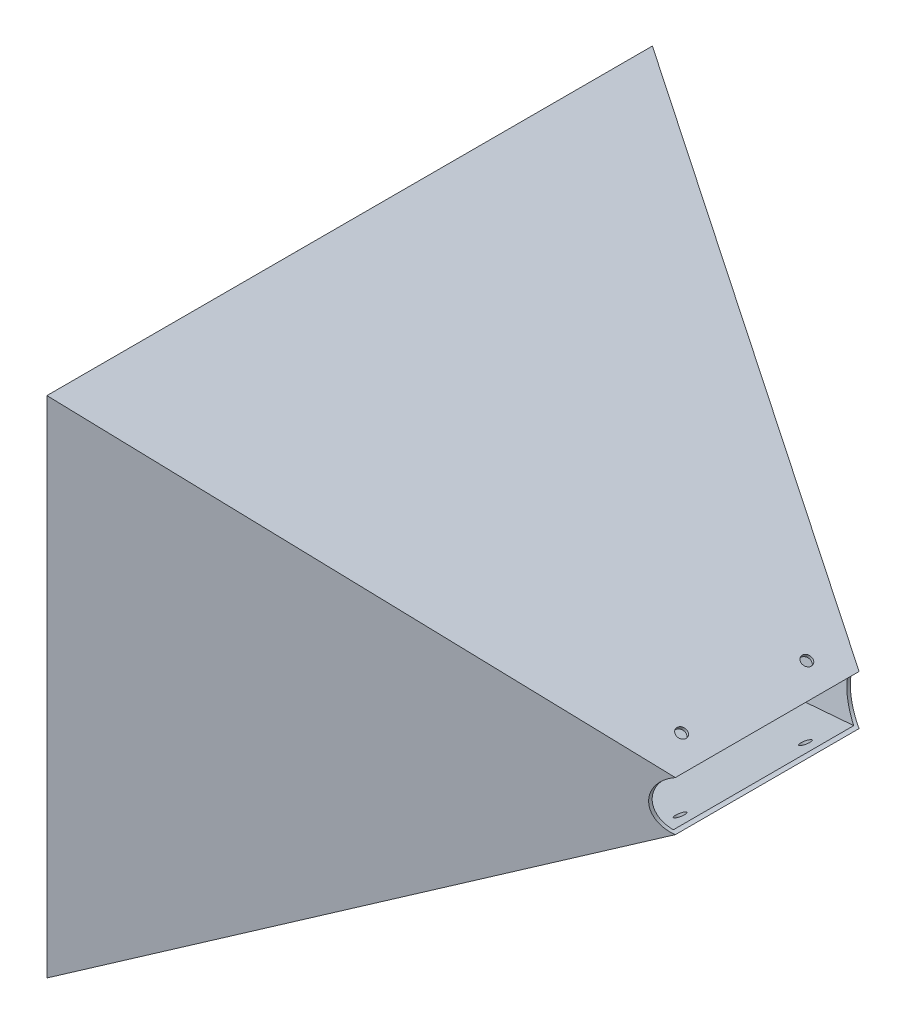
ISO-10303-21;
HEADER;
FILE_DESCRIPTION(('STEP AP214'),'2;1');
FILE_NAME('part.step','',(''),(''),'','','');
FILE_SCHEMA(('AUTOMOTIVE_DESIGN { 1 0 10303 214 1 1 1 1 }'));
ENDSEC;
DATA;
#1=APPLICATION_CONTEXT('core data for automotive mechanical design processes');
#2=APPLICATION_PROTOCOL_DEFINITION('international standard','automotive_design',2000,#1);
#3=PRODUCT_CONTEXT('',#1,'mechanical');
#4=PRODUCT('Part','Part','',(#3));
#5=PRODUCT_RELATED_PRODUCT_CATEGORY('part','',(#4));
#6=PRODUCT_DEFINITION_FORMATION('','',#4);
#7=PRODUCT_DEFINITION_CONTEXT('part definition',#1,'design');
#8=PRODUCT_DEFINITION('design','',#6,#7);
#9=PRODUCT_DEFINITION_SHAPE('','',#8);
#10=(LENGTH_UNIT() NAMED_UNIT(*) SI_UNIT(.MILLI.,.METRE.));
#11=(NAMED_UNIT(*) PLANE_ANGLE_UNIT() SI_UNIT($,.RADIAN.));
#12=(NAMED_UNIT(*) SI_UNIT($,.STERADIAN.) SOLID_ANGLE_UNIT());
#13=UNCERTAINTY_MEASURE_WITH_UNIT(LENGTH_MEASURE(1.E-05),#10,'distance_accuracy_value','');
#14=(GEOMETRIC_REPRESENTATION_CONTEXT(3) GLOBAL_UNCERTAINTY_ASSIGNED_CONTEXT((#13)) GLOBAL_UNIT_ASSIGNED_CONTEXT((#10,
#11,#12)) REPRESENTATION_CONTEXT('',''));
#15=CARTESIAN_POINT('',(0.,0.,0.));
#16=DIRECTION('',(0.,0.,1.));
#17=DIRECTION('',(1.,0.,0.));
#18=AXIS2_PLACEMENT_3D('',#15,#16,#17);
#19=CARTESIAN_POINT('',(-3.99999999999992,-290.,189.));
#20=DIRECTION('',(0.450780571280258,0.,0.892634794614373));
#21=DIRECTION('',(0.892634794614373,0.,-0.450780571280258));
#22=AXIS2_PLACEMENT_3D('',#19,#20,#21);
#23=PLANE('',#22);
#24=DIRECTION('',(0.802754938265514,0.437312758241847,-0.405391243824085));
#25=VECTOR('',#24,1.);
#26=CARTESIAN_POINT('',(-36.8684121138477,-29.7482783457112,205.598548117493));
#27=LINE('',#26,#25);
#28=CARTESIAN_POINT('',(-204.,-120.795710387367,290.));
#29=VERTEX_POINT('',#28);
#30=CARTESIAN_POINT('',(-4.,-11.842719282327,189.));
#31=VERTEX_POINT('',#30);
#32=EDGE_CURVE('E114',#29,#31,#27,.T.);
#33=ORIENTED_EDGE('',*,*,#32,.T.);
#34=CARTESIAN_POINT('',(0.,0.,186.98));
#35=DIRECTION('',(0.450780571280258,0.,0.892634794614373));
#36=DIRECTION('',(0.892634794614373,0.,-0.450780571280258));
#37=AXIS2_PLACEMENT_3D('',#34,#35,#36);
#38=ELLIPSE('',#37,14.0034872888863,12.5);
#39=CARTESIAN_POINT('',(-4.00000000000001,11.842719282327,189.));
#40=VERTEX_POINT('',#39);
#41=EDGE_CURVE('E100',#31,#40,#38,.F.);
#42=ORIENTED_EDGE('',*,*,#41,.T.);
#43=DIRECTION('',(-0.802754938265514,0.437312758241846,0.405391243824085));
#44=VECTOR('',#43,1.);
#45=CARTESIAN_POINT('',(-204.,120.795710387367,290.));
#46=LINE('',#45,#44);
#47=CARTESIAN_POINT('',(-204.,120.795710387367,290.));
#48=VERTEX_POINT('',#47);
#49=EDGE_CURVE('E111',#40,#48,#46,.T.);
#50=ORIENTED_EDGE('',*,*,#49,.T.);
#51=DIRECTION('',(0.,-1.,0.));
#52=VECTOR('',#51,1.);
#53=CARTESIAN_POINT('',(-204.,-120.795710387367,290.));
#54=LINE('',#53,#52);
#55=EDGE_CURVE('E123',#48,#29,#54,.T.);
#56=ORIENTED_EDGE('',*,*,#55,.T.);
#57=EDGE_LOOP('',(#33,#42,#50,#56));
#58=FACE_BOUND('',#57,.T.);
#59=ADVANCED_FACE('F34',(#58),#23,.T.);
#60=CARTESIAN_POINT('',(-3.99999999999992,-290.,101.));
#61=DIRECTION('',(0.450780571280258,0.,-0.892634794614373));
#62=DIRECTION('',(-0.892634794614373,0.,-0.450780571280258));
#63=AXIS2_PLACEMENT_3D('',#60,#61,#62);
#64=PLANE('',#63);
#65=DIRECTION('',(0.802754938265514,-0.437312758241846,0.405391243824085));
#66=VECTOR('',#65,1.);
#67=CARTESIAN_POINT('',(-109.625351356279,69.3837091162637,47.6591975650792));
#68=LINE('',#67,#66);
#69=CARTESIAN_POINT('',(-204.,120.795710387367,0.));
#70=VERTEX_POINT('',#69);
#71=CARTESIAN_POINT('',(-4.00000000000001,11.842719282327,101.));
#72=VERTEX_POINT('',#71);
#73=EDGE_CURVE('E125',#70,#72,#68,.T.);
#74=ORIENTED_EDGE('',*,*,#73,.T.);
#75=CARTESIAN_POINT('',(0.,0.,103.02));
#76=DIRECTION('',(0.450780571280258,0.,-0.892634794614373));
#77=DIRECTION('',(-0.892634794614373,0.,-0.450780571280258));
#78=AXIS2_PLACEMENT_3D('',#75,#76,#77);
#79=ELLIPSE('',#78,14.0034872888863,12.5);
#80=CARTESIAN_POINT('',(-4.,-11.842719282327,101.));
#81=VERTEX_POINT('',#80);
#82=EDGE_CURVE('E103',#72,#81,#79,.F.);
#83=ORIENTED_EDGE('',*,*,#82,.T.);
#84=DIRECTION('',(-0.802754938265514,-0.437312758241847,-0.405391243824085));
#85=VECTOR('',#84,1.);
#86=CARTESIAN_POINT('',(57.5062365298734,21.6637229253918,132.060649447586));
#87=LINE('',#86,#85);
#88=CARTESIAN_POINT('',(-204.,-120.795710387367,0.));
#89=VERTEX_POINT('',#88);
#90=EDGE_CURVE('E175',#81,#89,#87,.T.);
#91=ORIENTED_EDGE('',*,*,#90,.T.);
#92=DIRECTION('',(0.,-1.,0.));
#93=VECTOR('',#92,1.);
#94=CARTESIAN_POINT('',(-204.,-120.795710387367,0.));
#95=LINE('',#94,#93);
#96=EDGE_CURVE('E120',#70,#89,#95,.T.);
#97=ORIENTED_EDGE('',*,*,#96,.F.);
#98=EDGE_LOOP('',(#74,#83,#91,#97));
#99=FACE_BOUND('',#98,.T.);
#100=ADVANCED_FACE('F185',(#99),#64,.T.);
#101=CARTESIAN_POINT('',(-204.717578032364,119.478485361994,290.));
#102=DIRECTION('',(-0.478385354909303,-0.878150016915276,0.));
#103=DIRECTION('',(0.878150016915277,-0.478385354909303,0.));
#104=AXIS2_PLACEMENT_3D('',#101,#102,#103);
#105=PLANE('',#104);
#106=CARTESIAN_POINT('',(-15.7383607446507,16.5292304610658,115.));
#107=DIRECTION('',(-0.478385354909303,-0.878150016915276,0.));
#108=DIRECTION('',(0.878150016915277,-0.478385354909303,0.));
#109=AXIS2_PLACEMENT_3D('',#106,#107,#108);
#110=CIRCLE('',#109,2.5);
#111=CARTESIAN_POINT('',(-13.5429857023625,15.3332670737926,115.));
#112=VERTEX_POINT('',#111);
#113=EDGE_CURVE('E148',#112,#112,#110,.T.);
#114=ORIENTED_EDGE('',*,*,#113,.F.);
#115=EDGE_LOOP('',(#114));
#116=FACE_BOUND('',#115,.T.);
#117=CARTESIAN_POINT('',(-15.7383607446507,16.5292304610658,175.));
#118=DIRECTION('',(-0.478385354909303,-0.878150016915276,0.));
#119=DIRECTION('',(0.878150016915277,-0.478385354909303,0.));
#120=AXIS2_PLACEMENT_3D('',#117,#118,#119);
#121=CIRCLE('',#120,2.5);
#122=CARTESIAN_POINT('',(-13.5429857023625,15.3332670737926,175.));
#123=VERTEX_POINT('',#122);
#124=EDGE_CURVE('E145',#123,#123,#121,.T.);
#125=ORIENTED_EDGE('',*,*,#124,.F.);
#126=EDGE_LOOP('',(#125));
#127=FACE_BOUND('',#126,.T.);
#128=DIRECTION('',(0.802754938265514,-0.437312758241846,0.405391243824085));
#129=VECTOR('',#128,1.);
#130=CARTESIAN_POINT('',(-110.771859422809,68.3001501418769,48.7606294661478));
#131=LINE('',#130,#129);
#132=CARTESIAN_POINT('',(-204.,119.087573997107,1.68041847466639));
#133=VERTEX_POINT('',#132);
#134=CARTESIAN_POINT('',(-5.76040494145859,11.0935898117075,101.79141397923));
#135=VERTEX_POINT('',#134);
#136=EDGE_CURVE('E164',#133,#135,#131,.T.);
#137=ORIENTED_EDGE('',*,*,#136,.T.);
#138=DIRECTION('',(0.,0.,-1.));
#139=VECTOR('',#138,1.);
#140=CARTESIAN_POINT('',(-5.76040494145854,11.0935898117075,264.));
#141=LINE('',#140,#139);
#142=CARTESIAN_POINT('',(-5.76040494145854,11.0935898117075,188.20858602077));
#143=VERTEX_POINT('',#142);
#144=EDGE_CURVE('E48',#135,#143,#141,.F.);
#145=ORIENTED_EDGE('',*,*,#144,.T.);
#146=DIRECTION('',(-0.802754938265514,0.437312758241846,0.405391243824085));
#147=VECTOR('',#146,1.);
#148=CARTESIAN_POINT('',(-205.14650806653,119.71215141298,288.898568098931));
#149=LINE('',#148,#147);
#150=CARTESIAN_POINT('',(-204.,119.087573997107,288.319581525334));
#151=VERTEX_POINT('',#150);
#152=EDGE_CURVE('E55',#143,#151,#149,.T.);
#153=ORIENTED_EDGE('',*,*,#152,.T.);
#154=DIRECTION('',(0.,0.,-1.));
#155=VECTOR('',#154,1.);
#156=CARTESIAN_POINT('',(-204.,119.087573997107,290.));
#157=LINE('',#156,#155);
#158=EDGE_CURVE('E173',#151,#133,#157,.T.);
#159=ORIENTED_EDGE('',*,*,#158,.T.);
#160=EDGE_LOOP('',(#137,#145,#153,#159));
#161=FACE_BOUND('',#160,.T.);
#162=ADVANCED_FACE('F213',(#116,#127,#161),#105,.T.);
#163=CARTESIAN_POINT('',(-4.71757803236395,-10.5254942569541,290.));
#164=DIRECTION('',(-0.478385354909303,0.878150016915276,0.));
#165=DIRECTION('',(-0.878150016915276,-0.478385354909303,0.));
#166=AXIS2_PLACEMENT_3D('',#163,#164,#165);
#167=PLANE('',#166);
#168=CARTESIAN_POINT('',(-15.7383607446507,-16.5292304610658,115.));
#169=DIRECTION('',(-0.478385354909303,0.878150016915276,0.));
#170=DIRECTION('',(-0.878150016915276,-0.478385354909303,0.));
#171=AXIS2_PLACEMENT_3D('',#168,#169,#170);
#172=CIRCLE('',#171,2.5);
#173=CARTESIAN_POINT('',(-17.9337357869389,-17.7251938483391,115.));
#174=VERTEX_POINT('',#173);
#175=EDGE_CURVE('E141',#174,#174,#172,.T.);
#176=ORIENTED_EDGE('',*,*,#175,.F.);
#177=EDGE_LOOP('',(#176));
#178=FACE_BOUND('',#177,.T.);
#179=CARTESIAN_POINT('',(-15.7383607446507,-16.5292304610658,175.));
#180=DIRECTION('',(-0.478385354909303,0.878150016915276,0.));
#181=DIRECTION('',(-0.878150016915276,-0.478385354909303,0.));
#182=AXIS2_PLACEMENT_3D('',#179,#180,#181);
#183=CIRCLE('',#182,2.5);
#184=CARTESIAN_POINT('',(-17.9337357869389,-17.7251938483391,175.));
#185=VERTEX_POINT('',#184);
#186=EDGE_CURVE('E136',#185,#185,#183,.T.);
#187=ORIENTED_EDGE('',*,*,#186,.F.);
#188=EDGE_LOOP('',(#187));
#189=FACE_BOUND('',#188,.T.);
#190=DIRECTION('',(0.802754938265514,0.437312758241847,-0.405391243824085));
#191=VECTOR('',#190,1.);
#192=CARTESIAN_POINT('',(-38.0149201803781,-28.6647193713243,204.497116216425));
#193=LINE('',#192,#191);
#194=CARTESIAN_POINT('',(-204.,-119.087573997107,288.319581525334));
#195=VERTEX_POINT('',#194);
#196=CARTESIAN_POINT('',(-5.76040494145851,-11.0935898117075,188.20858602077));
#197=VERTEX_POINT('',#196);
#198=EDGE_CURVE('E167',#195,#197,#193,.T.);
#199=ORIENTED_EDGE('',*,*,#198,.T.);
#200=DIRECTION('',(0.,0.,-1.));
#201=VECTOR('',#200,1.);
#202=CARTESIAN_POINT('',(-5.76040494145851,-11.0935898117075,264.));
#203=LINE('',#202,#201);
#204=CARTESIAN_POINT('',(-5.7604049414585,-11.0935898117075,101.79141397923));
#205=VERTEX_POINT('',#204);
#206=EDGE_CURVE('E331',#197,#205,#203,.T.);
#207=ORIENTED_EDGE('',*,*,#206,.T.);
#208=DIRECTION('',(-0.802754938265514,-0.437312758241847,-0.405391243824085));
#209=VECTOR('',#208,1.);
#210=CARTESIAN_POINT('',(56.359728463343,22.7472818997787,133.162081348655));
#211=LINE('',#210,#209);
#212=CARTESIAN_POINT('',(-204.,-119.087573997107,1.68041847466637));
#213=VERTEX_POINT('',#212);
#214=EDGE_CURVE('E139',#205,#213,#211,.T.);
#215=ORIENTED_EDGE('',*,*,#214,.T.);
#216=DIRECTION('',(0.,0.,-1.));
#217=VECTOR('',#216,1.);
#218=CARTESIAN_POINT('',(-204.,-119.087573997107,290.));
#219=LINE('',#218,#217);
#220=EDGE_CURVE('E176',#195,#213,#219,.T.);
#221=ORIENTED_EDGE('',*,*,#220,.F.);
#222=EDGE_LOOP('',(#199,#207,#215,#221));
#223=FACE_BOUND('',#222,.T.);
#224=ADVANCED_FACE('F220',(#178,#189,#223),#167,.T.);
#225=CARTESIAN_POINT('',(-204.,-120.795710387367,290.));
#226=DIRECTION('',(1.,0.,0.));
#227=DIRECTION('',(0.,1.,0.));
#228=AXIS2_PLACEMENT_3D('',#225,#226,#227);
#229=PLANE('',#228);
#230=ORIENTED_EDGE('',*,*,#96,.T.);
#231=DIRECTION('',(0.,0.,-1.));
#232=VECTOR('',#231,1.);
#233=CARTESIAN_POINT('',(-204.,-120.795710387367,290.));
#234=LINE('',#233,#232);
#235=EDGE_CURVE('E132',#29,#89,#234,.T.);
#236=ORIENTED_EDGE('',*,*,#235,.F.);
#237=ORIENTED_EDGE('',*,*,#55,.F.);
#238=DIRECTION('',(0.,0.,-1.));
#239=VECTOR('',#238,1.);
#240=CARTESIAN_POINT('',(-204.,120.795710387367,290.));
#241=LINE('',#240,#239);
#242=EDGE_CURVE('E108',#48,#70,#241,.T.);
#243=ORIENTED_EDGE('',*,*,#242,.T.);
#244=EDGE_LOOP('',(#230,#236,#237,#243));
#245=FACE_BOUND('',#244,.T.);
#246=DIRECTION('',(0.,-1.,0.));
#247=VECTOR('',#246,1.);
#248=CARTESIAN_POINT('',(-204.,-290.,1.68041847466636));
#249=LINE('',#248,#247);
#250=EDGE_CURVE('E169',#133,#213,#249,.T.);
#251=ORIENTED_EDGE('',*,*,#250,.F.);
#252=ORIENTED_EDGE('',*,*,#158,.F.);
#253=DIRECTION('',(0.,-1.,0.));
#254=VECTOR('',#253,1.);
#255=CARTESIAN_POINT('',(-204.,-120.795710387367,288.319581525334));
#256=LINE('',#255,#254);
#257=EDGE_CURVE('E179',#151,#195,#256,.T.);
#258=ORIENTED_EDGE('',*,*,#257,.T.);
#259=ORIENTED_EDGE('',*,*,#220,.T.);
#260=EDGE_LOOP('',(#251,#252,#258,#259));
#261=FACE_BOUND('',#260,.T.);
#262=ADVANCED_FACE('F188',(#245,#261),#229,.F.);
#263=CARTESIAN_POINT('',(-204.,120.795710387367,290.));
#264=DIRECTION('',(-0.478385354909303,-0.878150016915276,0.));
#265=DIRECTION('',(0.878150016915277,-0.478385354909303,0.));
#266=AXIS2_PLACEMENT_3D('',#263,#264,#265);
#267=PLANE('',#266);
#268=CARTESIAN_POINT('',(-15.0207827122867,17.8464554864387,115.));
#269=DIRECTION('',(0.478385354909303,0.878150016915277,0.));
#270=DIRECTION('',(-0.878150016915277,0.478385354909303,0.));
#271=AXIS2_PLACEMENT_3D('',#268,#269,#270);
#272=CIRCLE('',#271,2.5);
#273=CARTESIAN_POINT('',(-17.2161577545749,19.042418873712,115.));
#274=VERTEX_POINT('',#273);
#275=EDGE_CURVE('E116',#274,#274,#272,.T.);
#276=ORIENTED_EDGE('',*,*,#275,.F.);
#277=EDGE_LOOP('',(#276));
#278=FACE_BOUND('',#277,.T.);
#279=CARTESIAN_POINT('',(-15.0207827122867,17.8464554864387,175.));
#280=DIRECTION('',(0.478385354909303,0.878150016915277,0.));
#281=DIRECTION('',(-0.878150016915277,0.478385354909303,0.));
#282=AXIS2_PLACEMENT_3D('',#279,#280,#281);
#283=CIRCLE('',#282,2.5);
#284=CARTESIAN_POINT('',(-17.2161577545749,19.042418873712,175.));
#285=VERTEX_POINT('',#284);
#286=EDGE_CURVE('E147',#285,#285,#283,.T.);
#287=ORIENTED_EDGE('',*,*,#286,.F.);
#288=EDGE_LOOP('',(#287));
#289=FACE_BOUND('',#288,.T.);
#290=ORIENTED_EDGE('',*,*,#73,.F.);
#291=ORIENTED_EDGE('',*,*,#242,.F.);
#292=ORIENTED_EDGE('',*,*,#49,.F.);
#293=DIRECTION('',(0.,0.,-1.));
#294=VECTOR('',#293,1.);
#295=CARTESIAN_POINT('',(-4.,11.842719282327,290.));
#296=LINE('',#295,#294);
#297=EDGE_CURVE('E42',#40,#72,#296,.T.);
#298=ORIENTED_EDGE('',*,*,#297,.T.);
#299=EDGE_LOOP('',(#290,#291,#292,#298));
#300=FACE_BOUND('',#299,.T.);
#301=ADVANCED_FACE('F36',(#278,#289,#300),#267,.F.);
#302=CARTESIAN_POINT('',(-4.,-11.842719282327,290.));
#303=DIRECTION('',(-0.478385354909303,0.878150016915276,0.));
#304=DIRECTION('',(-0.878150016915276,-0.478385354909303,0.));
#305=AXIS2_PLACEMENT_3D('',#302,#303,#304);
#306=PLANE('',#305);
#307=CARTESIAN_POINT('',(-15.0207827122867,-17.8464554864388,115.));
#308=DIRECTION('',(0.478385354909303,-0.878150016915276,0.));
#309=DIRECTION('',(0.878150016915276,0.478385354909303,0.));
#310=AXIS2_PLACEMENT_3D('',#307,#308,#309);
#311=CIRCLE('',#310,2.5);
#312=CARTESIAN_POINT('',(-12.8254076699985,-16.6504920991655,115.));
#313=VERTEX_POINT('',#312);
#314=EDGE_CURVE('E144',#313,#313,#311,.T.);
#315=ORIENTED_EDGE('',*,*,#314,.F.);
#316=EDGE_LOOP('',(#315));
#317=FACE_BOUND('',#316,.T.);
#318=CARTESIAN_POINT('',(-15.0207827122867,-17.8464554864388,175.));
#319=DIRECTION('',(0.478385354909303,-0.878150016915276,0.));
#320=DIRECTION('',(0.878150016915276,0.478385354909303,0.));
#321=AXIS2_PLACEMENT_3D('',#318,#319,#320);
#322=CIRCLE('',#321,2.5);
#323=CARTESIAN_POINT('',(-12.8254076699985,-16.6504920991655,175.));
#324=VERTEX_POINT('',#323);
#325=EDGE_CURVE('E140',#324,#324,#322,.T.);
#326=ORIENTED_EDGE('',*,*,#325,.F.);
#327=EDGE_LOOP('',(#326));
#328=FACE_BOUND('',#327,.T.);
#329=ORIENTED_EDGE('',*,*,#90,.F.);
#330=DIRECTION('',(0.,0.,-1.));
#331=VECTOR('',#330,1.);
#332=CARTESIAN_POINT('',(-4.,-11.842719282327,290.));
#333=LINE('',#332,#331);
#334=EDGE_CURVE('E129',#31,#81,#333,.T.);
#335=ORIENTED_EDGE('',*,*,#334,.F.);
#336=ORIENTED_EDGE('',*,*,#32,.F.);
#337=ORIENTED_EDGE('',*,*,#235,.T.);
#338=EDGE_LOOP('',(#329,#335,#336,#337));
#339=FACE_BOUND('',#338,.T.);
#340=ADVANCED_FACE('F192',(#317,#328,#339),#306,.F.);
#341=CARTESIAN_POINT('',(-4.67617085692031,-290.,187.661047808078));
#342=DIRECTION('',(0.450780571280258,0.,0.892634794614373));
#343=DIRECTION('',(0.892634794614373,0.,-0.450780571280258));
#344=AXIS2_PLACEMENT_3D('',#341,#342,#343);
#345=PLANE('',#344);
#346=CARTESIAN_POINT('',(0.,0.,185.299581525334));
#347=DIRECTION('',(0.450780571280258,0.,0.892634794614373));
#348=DIRECTION('',(0.892634794614373,0.,-0.450780571280258));
#349=AXIS2_PLACEMENT_3D('',#346,#347,#348);
#350=ELLIPSE('',#349,14.0034872888863,12.5);
#351=EDGE_CURVE('E336',#197,#143,#350,.F.);
#352=ORIENTED_EDGE('',*,*,#351,.F.);
#353=ORIENTED_EDGE('',*,*,#198,.F.);
#354=ORIENTED_EDGE('',*,*,#257,.F.);
#355=ORIENTED_EDGE('',*,*,#152,.F.);
#356=EDGE_LOOP('',(#352,#353,#354,#355));
#357=FACE_BOUND('',#356,.T.);
#358=ADVANCED_FACE('F194',(#357),#345,.F.);
#359=CARTESIAN_POINT('',(-4.67617085692031,-290.,102.338952191922));
#360=DIRECTION('',(0.450780571280258,0.,-0.892634794614373));
#361=DIRECTION('',(-0.892634794614373,0.,-0.450780571280258));
#362=AXIS2_PLACEMENT_3D('',#359,#360,#361);
#363=PLANE('',#362);
#364=CARTESIAN_POINT('',(0.,0.,104.700418474666));
#365=DIRECTION('',(0.450780571280258,0.,-0.892634794614373));
#366=DIRECTION('',(-0.892634794614373,0.,-0.450780571280258));
#367=AXIS2_PLACEMENT_3D('',#364,#365,#366);
#368=ELLIPSE('',#367,14.0034872888863,12.5);
#369=EDGE_CURVE('E11',#135,#205,#368,.F.);
#370=ORIENTED_EDGE('',*,*,#369,.F.);
#371=ORIENTED_EDGE('',*,*,#136,.F.);
#372=ORIENTED_EDGE('',*,*,#250,.T.);
#373=ORIENTED_EDGE('',*,*,#214,.F.);
#374=EDGE_LOOP('',(#370,#371,#372,#373));
#375=FACE_BOUND('',#374,.T.);
#376=ADVANCED_FACE('F201',(#375),#363,.F.);
#377=CARTESIAN_POINT('',(-24.5884898104727,-0.28345514813333,175.));
#378=DIRECTION('',(0.478385354909303,-0.878150016915276,0.));
#379=DIRECTION('',(0.878150016915276,0.478385354909303,0.));
#380=AXIS2_PLACEMENT_3D('',#377,#378,#379);
#381=CYLINDRICAL_SURFACE('',#380,2.5);
#382=ORIENTED_EDGE('',*,*,#186,.T.);
#383=EDGE_LOOP('',(#382));
#384=FACE_BOUND('',#383,.T.);
#385=ORIENTED_EDGE('',*,*,#325,.T.);
#386=EDGE_LOOP('',(#385));
#387=FACE_BOUND('',#386,.T.);
#388=ADVANCED_FACE('F217',(#384,#387),#381,.F.);
#389=CARTESIAN_POINT('',(-24.5884898104727,-0.28345514813333,115.));
#390=DIRECTION('',(0.478385354909303,-0.878150016915276,0.));
#391=DIRECTION('',(0.878150016915276,0.478385354909303,0.));
#392=AXIS2_PLACEMENT_3D('',#389,#390,#391);
#393=CYLINDRICAL_SURFACE('',#392,2.5);
#394=ORIENTED_EDGE('',*,*,#175,.T.);
#395=EDGE_LOOP('',(#394));
#396=FACE_BOUND('',#395,.T.);
#397=ORIENTED_EDGE('',*,*,#314,.T.);
#398=EDGE_LOOP('',(#397));
#399=FACE_BOUND('',#398,.T.);
#400=ADVANCED_FACE('F229',(#396,#399),#393,.F.);
#401=CARTESIAN_POINT('',(-23.6317191006541,2.03975518196385,175.));
#402=DIRECTION('',(0.478385354909303,0.878150016915277,0.));
#403=DIRECTION('',(-0.878150016915277,0.478385354909303,0.));
#404=AXIS2_PLACEMENT_3D('',#401,#402,#403);
#405=CYLINDRICAL_SURFACE('',#404,2.5);
#406=ORIENTED_EDGE('',*,*,#124,.T.);
#407=EDGE_LOOP('',(#406));
#408=FACE_BOUND('',#407,.T.);
#409=ORIENTED_EDGE('',*,*,#286,.T.);
#410=EDGE_LOOP('',(#409));
#411=FACE_BOUND('',#410,.T.);
#412=ADVANCED_FACE('F233',(#408,#411),#405,.F.);
#413=CARTESIAN_POINT('',(-23.6317191006541,2.03975518196385,115.));
#414=DIRECTION('',(0.478385354909303,0.878150016915277,0.));
#415=DIRECTION('',(-0.878150016915277,0.478385354909303,0.));
#416=AXIS2_PLACEMENT_3D('',#413,#414,#415);
#417=CYLINDRICAL_SURFACE('',#416,2.5);
#418=ORIENTED_EDGE('',*,*,#113,.T.);
#419=EDGE_LOOP('',(#418));
#420=FACE_BOUND('',#419,.T.);
#421=ORIENTED_EDGE('',*,*,#275,.T.);
#422=EDGE_LOOP('',(#421));
#423=FACE_BOUND('',#422,.T.);
#424=ADVANCED_FACE('F237',(#420,#423),#417,.F.);
#425=CARTESIAN_POINT('',(0.,0.,264.));
#426=DIRECTION('',(0.,0.,-1.));
#427=DIRECTION('',(-1.,0.,0.));
#428=AXIS2_PLACEMENT_3D('',#425,#426,#427);
#429=CYLINDRICAL_SURFACE('',#428,12.5);
#430=ORIENTED_EDGE('',*,*,#334,.T.);
#431=ORIENTED_EDGE('',*,*,#82,.F.);
#432=ORIENTED_EDGE('',*,*,#297,.F.);
#433=ORIENTED_EDGE('',*,*,#41,.F.);
#434=EDGE_LOOP('',(#430,#431,#432,#433));
#435=FACE_BOUND('',#434,.T.);
#436=ORIENTED_EDGE('',*,*,#351,.T.);
#437=ORIENTED_EDGE('',*,*,#144,.F.);
#438=ORIENTED_EDGE('',*,*,#369,.T.);
#439=ORIENTED_EDGE('',*,*,#206,.F.);
#440=EDGE_LOOP('',(#436,#437,#438,#439));
#441=FACE_BOUND('',#440,.T.);
#442=ADVANCED_FACE('F99',(#435,#441),#429,.F.);
#443=CLOSED_SHELL('',(#59,#100,#162,#224,#262,#301,#340,#358,#376,#388,#400,#412,#424,#442));
#444=MANIFOLD_SOLID_BREP('B2',#443);
#445=ADVANCED_BREP_SHAPE_REPRESENTATION('',(#18,#444),#14);
#446=SHAPE_DEFINITION_REPRESENTATION(#9,#445);
ENDSEC;
END-ISO-10303-21;
